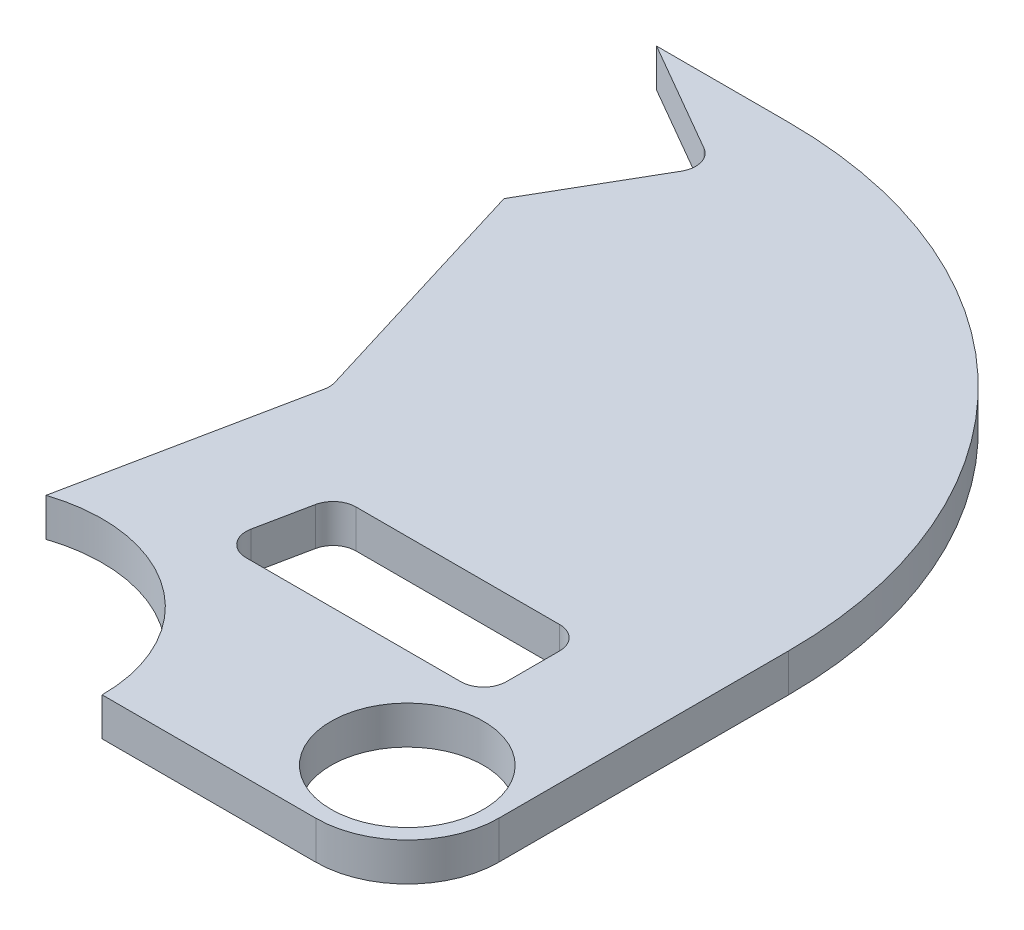
ISO-10303-21;
HEADER;
FILE_DESCRIPTION(('STEP AP214'),'2;1');
FILE_NAME('part.step','',(''),(''),'','','');
FILE_SCHEMA(('AUTOMOTIVE_DESIGN { 1 0 10303 214 1 1 1 1 }'));
ENDSEC;
DATA;
#1=APPLICATION_CONTEXT('core data for automotive mechanical design processes');
#2=APPLICATION_PROTOCOL_DEFINITION('international standard','automotive_design',2000,#1);
#3=PRODUCT_CONTEXT('',#1,'mechanical');
#4=PRODUCT('Part','Part','',(#3));
#5=PRODUCT_RELATED_PRODUCT_CATEGORY('part','',(#4));
#6=PRODUCT_DEFINITION_FORMATION('','',#4);
#7=PRODUCT_DEFINITION_CONTEXT('part definition',#1,'design');
#8=PRODUCT_DEFINITION('design','',#6,#7);
#9=PRODUCT_DEFINITION_SHAPE('','',#8);
#10=(LENGTH_UNIT() NAMED_UNIT(*) SI_UNIT(.MILLI.,.METRE.));
#11=(NAMED_UNIT(*) PLANE_ANGLE_UNIT() SI_UNIT($,.RADIAN.));
#12=(NAMED_UNIT(*) SI_UNIT($,.STERADIAN.) SOLID_ANGLE_UNIT());
#13=UNCERTAINTY_MEASURE_WITH_UNIT(LENGTH_MEASURE(1.E-05),#10,'distance_accuracy_value','');
#14=(GEOMETRIC_REPRESENTATION_CONTEXT(3) GLOBAL_UNCERTAINTY_ASSIGNED_CONTEXT((#13)) GLOBAL_UNIT_ASSIGNED_CONTEXT((#10,
#11,#12)) REPRESENTATION_CONTEXT('',''));
#15=CARTESIAN_POINT('',(0.,0.,0.));
#16=DIRECTION('',(0.,0.,1.));
#17=DIRECTION('',(1.,0.,0.));
#18=AXIS2_PLACEMENT_3D('',#15,#16,#17);
#19=CARTESIAN_POINT('',(0.,5.,50.));
#20=DIRECTION('',(0.,1.,0.));
#21=DIRECTION('',(0.,0.,1.));
#22=AXIS2_PLACEMENT_3D('',#19,#20,#21);
#23=PLANE('',#22);
#24=DIRECTION('',(0.,0.,-1.));
#25=VECTOR('',#24,1.);
#26=CARTESIAN_POINT('',(45.,5.,12.0294372515229));
#27=LINE('',#26,#25);
#28=CARTESIAN_POINT('',(45.,5.,22.));
#29=VERTEX_POINT('',#28);
#30=CARTESIAN_POINT('',(45.,5.,15.0294372515229));
#31=VERTEX_POINT('',#30);
#32=EDGE_CURVE('E396',#29,#31,#27,.T.);
#33=ORIENTED_EDGE('',*,*,#32,.F.);
#34=CARTESIAN_POINT('',(42.,5.,22.));
#35=DIRECTION('',(0.,1.,0.));
#36=DIRECTION('',(0.,0.,1.));
#37=AXIS2_PLACEMENT_3D('',#34,#35,#36);
#38=CIRCLE('',#37,3.);
#39=CARTESIAN_POINT('',(42.,5.,25.));
#40=VERTEX_POINT('',#39);
#41=EDGE_CURVE('E281',#29,#40,#38,.F.);
#42=ORIENTED_EDGE('',*,*,#41,.T.);
#43=DIRECTION('',(1.,0.,0.));
#44=VECTOR('',#43,1.);
#45=CARTESIAN_POINT('',(45.,5.,25.));
#46=LINE('',#45,#44);
#47=CARTESIAN_POINT('',(13.8804418757713,5.,25.));
#48=VERTEX_POINT('',#47);
#49=EDGE_CURVE('E387',#48,#40,#46,.T.);
#50=ORIENTED_EDGE('',*,*,#49,.F.);
#51=CARTESIAN_POINT('',(13.8804418757713,5.,22.));
#52=DIRECTION('',(0.,1.,0.));
#53=DIRECTION('',(0.,0.,1.));
#54=AXIS2_PLACEMENT_3D('',#51,#52,#53);
#55=CIRCLE('',#54,3.);
#56=CARTESIAN_POINT('',(10.9410541844315,5.,21.4));
#57=VERTEX_POINT('',#56);
#58=EDGE_CURVE('E285',#48,#57,#55,.F.);
#59=ORIENTED_EDGE('',*,*,#58,.T.);
#60=DIRECTION('',(-0.2,0.,0.979795897113271));
#61=VECTOR('',#60,1.);
#62=CARTESIAN_POINT('',(10.2062072615966,5.,25.));
#63=LINE('',#62,#61);
#64=CARTESIAN_POINT('',(12.36391434725,5.,14.4294372515229));
#65=VERTEX_POINT('',#64);
#66=EDGE_CURVE('E220',#65,#57,#63,.T.);
#67=ORIENTED_EDGE('',*,*,#66,.F.);
#68=CARTESIAN_POINT('',(15.3033020385898,5.,15.0294372515229));
#69=DIRECTION('',(0.,1.,0.));
#70=DIRECTION('',(0.,0.,1.));
#71=AXIS2_PLACEMENT_3D('',#68,#69,#70);
#72=CIRCLE('',#71,3.);
#73=CARTESIAN_POINT('',(15.3033020385898,5.,12.0294372515229));
#74=VERTEX_POINT('',#73);
#75=EDGE_CURVE('E289',#65,#74,#72,.F.);
#76=ORIENTED_EDGE('',*,*,#75,.T.);
#77=DIRECTION('',(-1.,0.,0.));
#78=VECTOR('',#77,1.);
#79=CARTESIAN_POINT('',(12.8538122958066,5.,12.0294372515229));
#80=LINE('',#79,#78);
#81=CARTESIAN_POINT('',(42.,5.,12.0294372515229));
#82=VERTEX_POINT('',#81);
#83=EDGE_CURVE('E393',#82,#74,#80,.T.);
#84=ORIENTED_EDGE('',*,*,#83,.F.);
#85=CARTESIAN_POINT('',(42.,5.,15.0294372515229));
#86=DIRECTION('',(0.,1.,0.));
#87=DIRECTION('',(0.,0.,1.));
#88=AXIS2_PLACEMENT_3D('',#85,#86,#87);
#89=CIRCLE('',#88,3.);
#90=EDGE_CURVE('E277',#82,#31,#89,.F.);
#91=ORIENTED_EDGE('',*,*,#90,.T.);
#92=EDGE_LOOP('',(#33,#42,#50,#59,#67,#76,#84,#91));
#93=FACE_BOUND('',#92,.T.);
#94=DIRECTION('',(0.292609232256339,0.,0.956232104249986));
#95=VECTOR('',#94,1.);
#96=CARTESIAN_POINT('',(-10.,5.,-32.679491924311));
#97=LINE('',#96,#95);
#98=CARTESIAN_POINT('',(-10.,5.,-32.679491924311));
#99=VERTEX_POINT('',#98);
#100=CARTESIAN_POINT('',(-0.223357320996515,5.,-0.729920376774135));
#101=VERTEX_POINT('',#100);
#102=EDGE_CURVE('E184',#99,#101,#97,.T.);
#103=ORIENTED_EDGE('',*,*,#102,.T.);
#104=CARTESIAN_POINT('',(-3.09205363374647,5.,0.147907319994881));
#105=DIRECTION('',(0.,1.,0.));
#106=DIRECTION('',(0.,0.,1.));
#107=AXIS2_PLACEMENT_3D('',#104,#105,#106);
#108=CIRCLE('',#107,3.);
#109=CARTESIAN_POINT('',(-0.15266594240666,5.,0.747907319994881));
#110=VERTEX_POINT('',#109);
#111=EDGE_CURVE('E180',#101,#110,#108,.F.);
#112=ORIENTED_EDGE('',*,*,#111,.T.);
#113=DIRECTION('',(-0.2,0.,0.979795897113271));
#114=VECTOR('',#113,1.);
#115=CARTESIAN_POINT('',(0.,5.,0.));
#116=LINE('',#115,#114);
#117=CARTESIAN_POINT('',(-6.33385735599495,5.,31.0294372515229));
#118=VERTEX_POINT('',#117);
#119=EDGE_CURVE('E172',#110,#118,#116,.T.);
#120=ORIENTED_EDGE('',*,*,#119,.T.);
#121=CARTESIAN_POINT('',(0.,5.,50.));
#122=DIRECTION('',(0.,-1.,0.));
#123=DIRECTION('',(0.,0.,1.));
#124=AXIS2_PLACEMENT_3D('',#121,#122,#123);
#125=CIRCLE('',#124,20.);
#126=CARTESIAN_POINT('',(20.,5.,50.));
#127=VERTEX_POINT('',#126);
#128=EDGE_CURVE('E177',#118,#127,#125,.T.);
#129=ORIENTED_EDGE('',*,*,#128,.T.);
#130=DIRECTION('',(1.,0.,0.));
#131=VECTOR('',#130,1.);
#132=CARTESIAN_POINT('',(48.,5.,50.));
#133=LINE('',#132,#131);
#134=CARTESIAN_POINT('',(48.,5.,50.));
#135=VERTEX_POINT('',#134);
#136=EDGE_CURVE('E199',#127,#135,#133,.T.);
#137=ORIENTED_EDGE('',*,*,#136,.T.);
#138=CARTESIAN_POINT('',(48.,5.,38.));
#139=DIRECTION('',(0.,1.,0.));
#140=DIRECTION('',(0.,0.,1.));
#141=AXIS2_PLACEMENT_3D('',#138,#139,#140);
#142=CIRCLE('',#141,12.);
#143=CARTESIAN_POINT('',(60.,5.,38.));
#144=VERTEX_POINT('',#143);
#145=EDGE_CURVE('E201',#135,#144,#142,.T.);
#146=ORIENTED_EDGE('',*,*,#145,.T.);
#147=DIRECTION('',(0.,0.,-1.));
#148=VECTOR('',#147,1.);
#149=CARTESIAN_POINT('',(60.,5.,0.));
#150=LINE('',#149,#148);
#151=CARTESIAN_POINT('',(60.,5.,0.));
#152=VERTEX_POINT('',#151);
#153=EDGE_CURVE('E206',#144,#152,#150,.T.);
#154=ORIENTED_EDGE('',*,*,#153,.T.);
#155=CARTESIAN_POINT('',(0.,5.,0.));
#156=DIRECTION('',(0.,1.,0.));
#157=DIRECTION('',(0.,0.,1.));
#158=AXIS2_PLACEMENT_3D('',#155,#156,#157);
#159=CIRCLE('',#158,60.);
#160=CARTESIAN_POINT('',(0.,5.,-60.));
#161=VERTEX_POINT('',#160);
#162=EDGE_CURVE('E208',#152,#161,#159,.T.);
#163=ORIENTED_EDGE('',*,*,#162,.T.);
#164=DIRECTION('',(-1.,0.,0.));
#165=VECTOR('',#164,1.);
#166=CARTESIAN_POINT('',(0.,5.,-60.));
#167=LINE('',#166,#165);
#168=CARTESIAN_POINT('',(-17.320508075689,5.,-60.));
#169=VERTEX_POINT('',#168);
#170=EDGE_CURVE('E210',#161,#169,#167,.T.);
#171=ORIENTED_EDGE('',*,*,#170,.T.);
#172=DIRECTION('',(0.866025403784442,0.,0.499999999999995));
#173=VECTOR('',#172,1.);
#174=CARTESIAN_POINT('',(-17.320508075689,5.,-60.));
#175=LINE('',#174,#173);
#176=CARTESIAN_POINT('',(-2.59807621135333,5.,-51.5));
#177=VERTEX_POINT('',#176);
#178=EDGE_CURVE('E212',#169,#177,#175,.T.);
#179=ORIENTED_EDGE('',*,*,#178,.T.);
#180=CARTESIAN_POINT('',(-4.09807621135331,5.,-48.9019237886467));
#181=DIRECTION('',(0.,1.,0.));
#182=DIRECTION('',(0.,0.,1.));
#183=AXIS2_PLACEMENT_3D('',#180,#181,#182);
#184=CIRCLE('',#183,3.);
#185=CARTESIAN_POINT('',(-1.49999999999999,5.,-47.4019237886467));
#186=VERTEX_POINT('',#185);
#187=EDGE_CURVE('E11',#177,#186,#184,.F.);
#188=ORIENTED_EDGE('',*,*,#187,.T.);
#189=DIRECTION('',(-0.499999999999995,0.,0.866025403784442));
#190=VECTOR('',#189,1.);
#191=CARTESIAN_POINT('',(0.,5.,-50.));
#192=LINE('',#191,#190);
#193=EDGE_CURVE('E214',#186,#99,#192,.T.);
#194=ORIENTED_EDGE('',*,*,#193,.T.);
#195=EDGE_LOOP('',(#103,#112,#120,#129,#137,#146,#154,#163,#171,#179,#188,#194));
#196=FACE_BOUND('',#195,.T.);
#197=CARTESIAN_POINT('',(48.,5.,38.));
#198=DIRECTION('',(0.,1.,0.));
#199=DIRECTION('',(0.,0.,1.));
#200=AXIS2_PLACEMENT_3D('',#197,#198,#199);
#201=CIRCLE('',#200,9.99999999999999);
#202=CARTESIAN_POINT('',(48.,5.,48.));
#203=VERTEX_POINT('',#202);
#204=EDGE_CURVE('E404',#203,#203,#201,.T.);
#205=ORIENTED_EDGE('',*,*,#204,.F.);
#206=EDGE_LOOP('',(#205));
#207=FACE_BOUND('',#206,.T.);
#208=ADVANCED_FACE('F36',(#93,#196,#207),#23,.T.);
#209=CARTESIAN_POINT('',(0.,0.,50.));
#210=DIRECTION('',(0.,1.,0.));
#211=DIRECTION('',(0.,0.,1.));
#212=AXIS2_PLACEMENT_3D('',#209,#210,#211);
#213=PLANE('',#212);
#214=DIRECTION('',(0.292609232256339,0.,0.956232104249986));
#215=VECTOR('',#214,1.);
#216=CARTESIAN_POINT('',(-10.,0.,-32.679491924311));
#217=LINE('',#216,#215);
#218=CARTESIAN_POINT('',(-10.,0.,-32.679491924311));
#219=VERTEX_POINT('',#218);
#220=CARTESIAN_POINT('',(-0.223357320996515,0.,-0.729920376774135));
#221=VERTEX_POINT('',#220);
#222=EDGE_CURVE('E217',#219,#221,#217,.T.);
#223=ORIENTED_EDGE('',*,*,#222,.F.);
#224=DIRECTION('',(-0.499999999999995,0.,0.866025403784442));
#225=VECTOR('',#224,1.);
#226=CARTESIAN_POINT('',(0.,0.,-50.));
#227=LINE('',#226,#225);
#228=CARTESIAN_POINT('',(-1.49999999999999,0.,-47.4019237886467));
#229=VERTEX_POINT('',#228);
#230=EDGE_CURVE('E236',#229,#219,#227,.T.);
#231=ORIENTED_EDGE('',*,*,#230,.F.);
#232=CARTESIAN_POINT('',(-4.09807621135331,0.,-48.9019237886467));
#233=DIRECTION('',(0.,1.,0.));
#234=DIRECTION('',(0.,0.,1.));
#235=AXIS2_PLACEMENT_3D('',#232,#233,#234);
#236=CIRCLE('',#235,3.);
#237=CARTESIAN_POINT('',(-2.59807621135333,0.,-51.5));
#238=VERTEX_POINT('',#237);
#239=EDGE_CURVE('E44',#229,#238,#236,.T.);
#240=ORIENTED_EDGE('',*,*,#239,.T.);
#241=DIRECTION('',(0.866025403784442,0.,0.499999999999995));
#242=VECTOR('',#241,1.);
#243=CARTESIAN_POINT('',(-17.320508075689,0.,-60.));
#244=LINE('',#243,#242);
#245=CARTESIAN_POINT('',(-17.320508075689,0.,-60.));
#246=VERTEX_POINT('',#245);
#247=EDGE_CURVE('E234',#246,#238,#244,.T.);
#248=ORIENTED_EDGE('',*,*,#247,.F.);
#249=DIRECTION('',(-1.,0.,0.));
#250=VECTOR('',#249,1.);
#251=CARTESIAN_POINT('',(0.,0.,-60.));
#252=LINE('',#251,#250);
#253=CARTESIAN_POINT('',(0.,0.,-60.));
#254=VERTEX_POINT('',#253);
#255=EDGE_CURVE('E232',#254,#246,#252,.T.);
#256=ORIENTED_EDGE('',*,*,#255,.F.);
#257=CARTESIAN_POINT('',(0.,0.,0.));
#258=DIRECTION('',(0.,1.,0.));
#259=DIRECTION('',(0.,0.,1.));
#260=AXIS2_PLACEMENT_3D('',#257,#258,#259);
#261=CIRCLE('',#260,60.);
#262=CARTESIAN_POINT('',(60.,0.,0.));
#263=VERTEX_POINT('',#262);
#264=EDGE_CURVE('E230',#263,#254,#261,.T.);
#265=ORIENTED_EDGE('',*,*,#264,.F.);
#266=DIRECTION('',(0.,0.,-1.));
#267=VECTOR('',#266,1.);
#268=CARTESIAN_POINT('',(60.,0.,0.));
#269=LINE('',#268,#267);
#270=CARTESIAN_POINT('',(60.,0.,38.));
#271=VERTEX_POINT('',#270);
#272=EDGE_CURVE('E228',#271,#263,#269,.T.);
#273=ORIENTED_EDGE('',*,*,#272,.F.);
#274=CARTESIAN_POINT('',(48.,0.,38.));
#275=DIRECTION('',(0.,1.,0.));
#276=DIRECTION('',(0.,0.,1.));
#277=AXIS2_PLACEMENT_3D('',#274,#275,#276);
#278=CIRCLE('',#277,12.);
#279=CARTESIAN_POINT('',(48.,0.,50.));
#280=VERTEX_POINT('',#279);
#281=EDGE_CURVE('E226',#280,#271,#278,.T.);
#282=ORIENTED_EDGE('',*,*,#281,.F.);
#283=DIRECTION('',(1.,0.,0.));
#284=VECTOR('',#283,1.);
#285=CARTESIAN_POINT('',(48.,0.,50.));
#286=LINE('',#285,#284);
#287=CARTESIAN_POINT('',(20.,0.,50.));
#288=VERTEX_POINT('',#287);
#289=EDGE_CURVE('E224',#288,#280,#286,.T.);
#290=ORIENTED_EDGE('',*,*,#289,.F.);
#291=CARTESIAN_POINT('',(0.,0.,50.));
#292=DIRECTION('',(0.,-1.,0.));
#293=DIRECTION('',(0.,0.,1.));
#294=AXIS2_PLACEMENT_3D('',#291,#292,#293);
#295=CIRCLE('',#294,20.);
#296=CARTESIAN_POINT('',(-6.33385735599495,0.,31.0294372515229));
#297=VERTEX_POINT('',#296);
#298=EDGE_CURVE('E222',#297,#288,#295,.T.);
#299=ORIENTED_EDGE('',*,*,#298,.F.);
#300=DIRECTION('',(-0.2,0.,0.979795897113271));
#301=VECTOR('',#300,1.);
#302=CARTESIAN_POINT('',(0.,0.,0.));
#303=LINE('',#302,#301);
#304=CARTESIAN_POINT('',(-0.15266594240666,0.,0.747907319994881));
#305=VERTEX_POINT('',#304);
#306=EDGE_CURVE('E190',#305,#297,#303,.T.);
#307=ORIENTED_EDGE('',*,*,#306,.F.);
#308=CARTESIAN_POINT('',(-3.09205363374647,0.,0.147907319994881));
#309=DIRECTION('',(0.,1.,0.));
#310=DIRECTION('',(0.,0.,1.));
#311=AXIS2_PLACEMENT_3D('',#308,#309,#310);
#312=CIRCLE('',#311,3.);
#313=EDGE_CURVE('E299',#305,#221,#312,.T.);
#314=ORIENTED_EDGE('',*,*,#313,.T.);
#315=EDGE_LOOP('',(#223,#231,#240,#248,#256,#265,#273,#282,#290,#299,#307,#314));
#316=FACE_BOUND('',#315,.T.);
#317=DIRECTION('',(-0.2,0.,0.979795897113271));
#318=VECTOR('',#317,1.);
#319=CARTESIAN_POINT('',(10.2062072615966,0.,25.));
#320=LINE('',#319,#318);
#321=CARTESIAN_POINT('',(12.36391434725,0.,14.4294372515229));
#322=VERTEX_POINT('',#321);
#323=CARTESIAN_POINT('',(10.9410541844315,0.,21.4));
#324=VERTEX_POINT('',#323);
#325=EDGE_CURVE('E410',#322,#324,#320,.T.);
#326=ORIENTED_EDGE('',*,*,#325,.T.);
#327=CARTESIAN_POINT('',(13.8804418757713,0.,22.));
#328=DIRECTION('',(0.,1.,0.));
#329=DIRECTION('',(0.,0.,1.));
#330=AXIS2_PLACEMENT_3D('',#327,#328,#329);
#331=CIRCLE('',#330,3.);
#332=CARTESIAN_POINT('',(13.8804418757713,0.,25.));
#333=VERTEX_POINT('',#332);
#334=EDGE_CURVE('E283',#324,#333,#331,.T.);
#335=ORIENTED_EDGE('',*,*,#334,.T.);
#336=DIRECTION('',(1.,0.,0.));
#337=VECTOR('',#336,1.);
#338=CARTESIAN_POINT('',(45.,0.,25.));
#339=LINE('',#338,#337);
#340=CARTESIAN_POINT('',(42.,0.,25.));
#341=VERTEX_POINT('',#340);
#342=EDGE_CURVE('E400',#333,#341,#339,.T.);
#343=ORIENTED_EDGE('',*,*,#342,.T.);
#344=CARTESIAN_POINT('',(42.,0.,22.));
#345=DIRECTION('',(0.,1.,0.));
#346=DIRECTION('',(0.,0.,1.));
#347=AXIS2_PLACEMENT_3D('',#344,#345,#346);
#348=CIRCLE('',#347,3.);
#349=CARTESIAN_POINT('',(45.,0.,22.));
#350=VERTEX_POINT('',#349);
#351=EDGE_CURVE('E279',#341,#350,#348,.T.);
#352=ORIENTED_EDGE('',*,*,#351,.T.);
#353=DIRECTION('',(0.,0.,-1.));
#354=VECTOR('',#353,1.);
#355=CARTESIAN_POINT('',(45.,0.,12.0294372515229));
#356=LINE('',#355,#354);
#357=CARTESIAN_POINT('',(45.,0.,15.0294372515229));
#358=VERTEX_POINT('',#357);
#359=EDGE_CURVE('E403',#350,#358,#356,.T.);
#360=ORIENTED_EDGE('',*,*,#359,.T.);
#361=CARTESIAN_POINT('',(42.,0.,15.0294372515229));
#362=DIRECTION('',(0.,1.,0.));
#363=DIRECTION('',(0.,0.,1.));
#364=AXIS2_PLACEMENT_3D('',#361,#362,#363);
#365=CIRCLE('',#364,3.);
#366=CARTESIAN_POINT('',(42.,0.,12.0294372515229));
#367=VERTEX_POINT('',#366);
#368=EDGE_CURVE('E275',#358,#367,#365,.T.);
#369=ORIENTED_EDGE('',*,*,#368,.T.);
#370=DIRECTION('',(-1.,0.,0.));
#371=VECTOR('',#370,1.);
#372=CARTESIAN_POINT('',(12.8538122958066,0.,12.0294372515229));
#373=LINE('',#372,#371);
#374=CARTESIAN_POINT('',(15.3033020385898,0.,12.0294372515229));
#375=VERTEX_POINT('',#374);
#376=EDGE_CURVE('E407',#367,#375,#373,.T.);
#377=ORIENTED_EDGE('',*,*,#376,.T.);
#378=CARTESIAN_POINT('',(15.3033020385898,0.,15.0294372515229));
#379=DIRECTION('',(0.,1.,0.));
#380=DIRECTION('',(0.,0.,1.));
#381=AXIS2_PLACEMENT_3D('',#378,#379,#380);
#382=CIRCLE('',#381,3.);
#383=EDGE_CURVE('E287',#375,#322,#382,.T.);
#384=ORIENTED_EDGE('',*,*,#383,.T.);
#385=EDGE_LOOP('',(#326,#335,#343,#352,#360,#369,#377,#384));
#386=FACE_BOUND('',#385,.T.);
#387=CARTESIAN_POINT('',(48.,0.,38.));
#388=DIRECTION('',(0.,1.,0.));
#389=DIRECTION('',(0.,0.,1.));
#390=AXIS2_PLACEMENT_3D('',#387,#388,#389);
#391=CIRCLE('',#390,9.99999999999999);
#392=CARTESIAN_POINT('',(48.,0.,48.));
#393=VERTEX_POINT('',#392);
#394=EDGE_CURVE('E433',#393,#393,#391,.T.);
#395=ORIENTED_EDGE('',*,*,#394,.T.);
#396=EDGE_LOOP('',(#395));
#397=FACE_BOUND('',#396,.T.);
#398=ADVANCED_FACE('F302',(#316,#386,#397),#213,.F.);
#399=CARTESIAN_POINT('',(-10.,5.,-32.679491924311));
#400=DIRECTION('',(0.956232104249986,0.,-0.292609232256339));
#401=DIRECTION('',(-0.292609232256339,0.,-0.956232104249986));
#402=AXIS2_PLACEMENT_3D('',#399,#400,#401);
#403=PLANE('',#402);
#404=ORIENTED_EDGE('',*,*,#222,.T.);
#405=DIRECTION('',(0.,-1.,0.));
#406=VECTOR('',#405,1.);
#407=CARTESIAN_POINT('',(-0.223357320996514,5.,-0.729920376774135));
#408=LINE('',#407,#406);
#409=EDGE_CURVE('E293',#221,#101,#408,.F.);
#410=ORIENTED_EDGE('',*,*,#409,.T.);
#411=ORIENTED_EDGE('',*,*,#102,.F.);
#412=DIRECTION('',(0.,-1.,0.));
#413=VECTOR('',#412,1.);
#414=CARTESIAN_POINT('',(-10.,5.,-32.679491924311));
#415=LINE('',#414,#413);
#416=EDGE_CURVE('E216',#99,#219,#415,.T.);
#417=ORIENTED_EDGE('',*,*,#416,.T.);
#418=EDGE_LOOP('',(#404,#410,#411,#417));
#419=FACE_BOUND('',#418,.T.);
#420=ADVANCED_FACE('F307',(#419),#403,.F.);
#421=CARTESIAN_POINT('',(0.,5.,0.));
#422=DIRECTION('',(0.979795897113271,0.,0.2));
#423=DIRECTION('',(0.2,0.,-0.979795897113271));
#424=AXIS2_PLACEMENT_3D('',#421,#422,#423);
#425=PLANE('',#424);
#426=ORIENTED_EDGE('',*,*,#119,.F.);
#427=DIRECTION('',(0.,-1.,0.));
#428=VECTOR('',#427,1.);
#429=CARTESIAN_POINT('',(-0.15266594240666,0.,0.747907319994881));
#430=LINE('',#429,#428);
#431=EDGE_CURVE('E291',#110,#305,#430,.T.);
#432=ORIENTED_EDGE('',*,*,#431,.T.);
#433=ORIENTED_EDGE('',*,*,#306,.T.);
#434=DIRECTION('',(0.,-1.,0.));
#435=VECTOR('',#434,1.);
#436=CARTESIAN_POINT('',(-6.33385735599495,5.,31.0294372515229));
#437=LINE('',#436,#435);
#438=EDGE_CURVE('E187',#118,#297,#437,.T.);
#439=ORIENTED_EDGE('',*,*,#438,.F.);
#440=EDGE_LOOP('',(#426,#432,#433,#439));
#441=FACE_BOUND('',#440,.T.);
#442=ADVANCED_FACE('F188',(#441),#425,.F.);
#443=CARTESIAN_POINT('',(0.,5.,50.));
#444=DIRECTION('',(0.,-1.,0.));
#445=DIRECTION('',(0.,0.,-1.));
#446=AXIS2_PLACEMENT_3D('',#443,#444,#445);
#447=CYLINDRICAL_SURFACE('',#446,20.);
#448=ORIENTED_EDGE('',*,*,#298,.T.);
#449=DIRECTION('',(0.,-1.,0.));
#450=VECTOR('',#449,1.);
#451=CARTESIAN_POINT('',(20.,5.,50.));
#452=LINE('',#451,#450);
#453=EDGE_CURVE('E194',#127,#288,#452,.T.);
#454=ORIENTED_EDGE('',*,*,#453,.F.);
#455=ORIENTED_EDGE('',*,*,#128,.F.);
#456=ORIENTED_EDGE('',*,*,#438,.T.);
#457=EDGE_LOOP('',(#448,#454,#455,#456));
#458=FACE_BOUND('',#457,.T.);
#459=ADVANCED_FACE('F196',(#458),#447,.F.);
#460=CARTESIAN_POINT('',(48.,5.,50.));
#461=DIRECTION('',(0.,0.,-1.));
#462=DIRECTION('',(-1.,0.,0.));
#463=AXIS2_PLACEMENT_3D('',#460,#461,#462);
#464=PLANE('',#463);
#465=ORIENTED_EDGE('',*,*,#289,.T.);
#466=DIRECTION('',(0.,-1.,0.));
#467=VECTOR('',#466,1.);
#468=CARTESIAN_POINT('',(48.,5.,50.));
#469=LINE('',#468,#467);
#470=EDGE_CURVE('E252',#135,#280,#469,.T.);
#471=ORIENTED_EDGE('',*,*,#470,.F.);
#472=ORIENTED_EDGE('',*,*,#136,.F.);
#473=ORIENTED_EDGE('',*,*,#453,.T.);
#474=EDGE_LOOP('',(#465,#471,#472,#473));
#475=FACE_BOUND('',#474,.T.);
#476=ADVANCED_FACE('F355',(#475),#464,.F.);
#477=CARTESIAN_POINT('',(48.,5.,38.));
#478=DIRECTION('',(0.,-1.,0.));
#479=DIRECTION('',(0.,0.,-1.));
#480=AXIS2_PLACEMENT_3D('',#477,#478,#479);
#481=CYLINDRICAL_SURFACE('',#480,12.);
#482=ORIENTED_EDGE('',*,*,#281,.T.);
#483=DIRECTION('',(0.,-1.,0.));
#484=VECTOR('',#483,1.);
#485=CARTESIAN_POINT('',(60.,5.,38.));
#486=LINE('',#485,#484);
#487=EDGE_CURVE('E249',#144,#271,#486,.T.);
#488=ORIENTED_EDGE('',*,*,#487,.F.);
#489=ORIENTED_EDGE('',*,*,#145,.F.);
#490=ORIENTED_EDGE('',*,*,#470,.T.);
#491=EDGE_LOOP('',(#482,#488,#489,#490));
#492=FACE_BOUND('',#491,.T.);
#493=ADVANCED_FACE('F351',(#492),#481,.T.);
#494=CARTESIAN_POINT('',(60.,5.,0.));
#495=DIRECTION('',(-1.,0.,0.));
#496=DIRECTION('',(0.,0.,1.));
#497=AXIS2_PLACEMENT_3D('',#494,#495,#496);
#498=PLANE('',#497);
#499=ORIENTED_EDGE('',*,*,#272,.T.);
#500=DIRECTION('',(0.,-1.,0.));
#501=VECTOR('',#500,1.);
#502=CARTESIAN_POINT('',(60.,5.,0.));
#503=LINE('',#502,#501);
#504=EDGE_CURVE('E246',#152,#263,#503,.T.);
#505=ORIENTED_EDGE('',*,*,#504,.F.);
#506=ORIENTED_EDGE('',*,*,#153,.F.);
#507=ORIENTED_EDGE('',*,*,#487,.T.);
#508=EDGE_LOOP('',(#499,#505,#506,#507));
#509=FACE_BOUND('',#508,.T.);
#510=ADVANCED_FACE('F347',(#509),#498,.F.);
#511=CARTESIAN_POINT('',(0.,5.,0.));
#512=DIRECTION('',(0.,-1.,0.));
#513=DIRECTION('',(0.,0.,-1.));
#514=AXIS2_PLACEMENT_3D('',#511,#512,#513);
#515=CYLINDRICAL_SURFACE('',#514,60.);
#516=ORIENTED_EDGE('',*,*,#264,.T.);
#517=DIRECTION('',(0.,-1.,0.));
#518=VECTOR('',#517,1.);
#519=CARTESIAN_POINT('',(0.,5.,-60.));
#520=LINE('',#519,#518);
#521=EDGE_CURVE('E243',#161,#254,#520,.T.);
#522=ORIENTED_EDGE('',*,*,#521,.F.);
#523=ORIENTED_EDGE('',*,*,#162,.F.);
#524=ORIENTED_EDGE('',*,*,#504,.T.);
#525=EDGE_LOOP('',(#516,#522,#523,#524));
#526=FACE_BOUND('',#525,.T.);
#527=ADVANCED_FACE('F343',(#526),#515,.T.);
#528=CARTESIAN_POINT('',(0.,5.,-60.));
#529=DIRECTION('',(0.,0.,1.));
#530=DIRECTION('',(1.,0.,0.));
#531=AXIS2_PLACEMENT_3D('',#528,#529,#530);
#532=PLANE('',#531);
#533=ORIENTED_EDGE('',*,*,#255,.T.);
#534=DIRECTION('',(0.,-1.,0.));
#535=VECTOR('',#534,1.);
#536=CARTESIAN_POINT('',(-17.320508075689,5.,-60.));
#537=LINE('',#536,#535);
#538=EDGE_CURVE('E240',#169,#246,#537,.T.);
#539=ORIENTED_EDGE('',*,*,#538,.F.);
#540=ORIENTED_EDGE('',*,*,#170,.F.);
#541=ORIENTED_EDGE('',*,*,#521,.T.);
#542=EDGE_LOOP('',(#533,#539,#540,#541));
#543=FACE_BOUND('',#542,.T.);
#544=ADVANCED_FACE('F340',(#543),#532,.F.);
#545=CARTESIAN_POINT('',(-17.320508075689,5.,-60.));
#546=DIRECTION('',(0.499999999999995,0.,-0.866025403784442));
#547=DIRECTION('',(-0.866025403784442,0.,-0.499999999999995));
#548=AXIS2_PLACEMENT_3D('',#545,#546,#547);
#549=PLANE('',#548);
#550=ORIENTED_EDGE('',*,*,#247,.T.);
#551=DIRECTION('',(0.,-1.,0.));
#552=VECTOR('',#551,1.);
#553=CARTESIAN_POINT('',(-2.59807621135333,5.,-51.5));
#554=LINE('',#553,#552);
#555=EDGE_CURVE('E51',#238,#177,#554,.F.);
#556=ORIENTED_EDGE('',*,*,#555,.T.);
#557=ORIENTED_EDGE('',*,*,#178,.F.);
#558=ORIENTED_EDGE('',*,*,#538,.T.);
#559=EDGE_LOOP('',(#550,#556,#557,#558));
#560=FACE_BOUND('',#559,.T.);
#561=ADVANCED_FACE('F336',(#560),#549,.F.);
#562=CARTESIAN_POINT('',(0.,5.,-50.));
#563=DIRECTION('',(0.866025403784442,0.,0.499999999999995));
#564=DIRECTION('',(0.499999999999995,0.,-0.866025403784442));
#565=AXIS2_PLACEMENT_3D('',#562,#563,#564);
#566=PLANE('',#565);
#567=ORIENTED_EDGE('',*,*,#193,.F.);
#568=DIRECTION('',(0.,-1.,0.));
#569=VECTOR('',#568,1.);
#570=CARTESIAN_POINT('',(-1.49999999999999,0.,-47.4019237886467));
#571=LINE('',#570,#569);
#572=EDGE_CURVE('E295',#186,#229,#571,.T.);
#573=ORIENTED_EDGE('',*,*,#572,.T.);
#574=ORIENTED_EDGE('',*,*,#230,.T.);
#575=ORIENTED_EDGE('',*,*,#416,.F.);
#576=EDGE_LOOP('',(#567,#573,#574,#575));
#577=FACE_BOUND('',#576,.T.);
#578=ADVANCED_FACE('F333',(#577),#566,.F.);
#579=CARTESIAN_POINT('',(45.,5.,25.));
#580=DIRECTION('',(0.,0.,-1.));
#581=DIRECTION('',(-1.,0.,0.));
#582=AXIS2_PLACEMENT_3D('',#579,#580,#581);
#583=PLANE('',#582);
#584=ORIENTED_EDGE('',*,*,#49,.T.);
#585=DIRECTION('',(0.,-1.,0.));
#586=VECTOR('',#585,1.);
#587=CARTESIAN_POINT('',(42.,0.,25.));
#588=LINE('',#587,#586);
#589=EDGE_CURVE('E267',#40,#341,#588,.T.);
#590=ORIENTED_EDGE('',*,*,#589,.T.);
#591=ORIENTED_EDGE('',*,*,#342,.F.);
#592=DIRECTION('',(0.,-1.,0.));
#593=VECTOR('',#592,1.);
#594=CARTESIAN_POINT('',(13.8804418757713,5.,25.));
#595=LINE('',#594,#593);
#596=EDGE_CURVE('E265',#333,#48,#595,.F.);
#597=ORIENTED_EDGE('',*,*,#596,.T.);
#598=EDGE_LOOP('',(#584,#590,#591,#597));
#599=FACE_BOUND('',#598,.T.);
#600=ADVANCED_FACE('F330',(#599),#583,.T.);
#601=CARTESIAN_POINT('',(45.,5.,12.0294372515229));
#602=DIRECTION('',(-1.,0.,0.));
#603=DIRECTION('',(0.,0.,1.));
#604=AXIS2_PLACEMENT_3D('',#601,#602,#603);
#605=PLANE('',#604);
#606=ORIENTED_EDGE('',*,*,#32,.T.);
#607=DIRECTION('',(0.,-1.,0.));
#608=VECTOR('',#607,1.);
#609=CARTESIAN_POINT('',(45.,0.,15.0294372515229));
#610=LINE('',#609,#608);
#611=EDGE_CURVE('E257',#31,#358,#610,.T.);
#612=ORIENTED_EDGE('',*,*,#611,.T.);
#613=ORIENTED_EDGE('',*,*,#359,.F.);
#614=DIRECTION('',(0.,-1.,0.));
#615=VECTOR('',#614,1.);
#616=CARTESIAN_POINT('',(45.,5.,22.));
#617=LINE('',#616,#615);
#618=EDGE_CURVE('E193',#350,#29,#617,.F.);
#619=ORIENTED_EDGE('',*,*,#618,.T.);
#620=EDGE_LOOP('',(#606,#612,#613,#619));
#621=FACE_BOUND('',#620,.T.);
#622=ADVANCED_FACE('F451',(#621),#605,.T.);
#623=CARTESIAN_POINT('',(12.8538122958066,5.,12.0294372515229));
#624=DIRECTION('',(0.,0.,1.));
#625=DIRECTION('',(1.,0.,0.));
#626=AXIS2_PLACEMENT_3D('',#623,#624,#625);
#627=PLANE('',#626);
#628=ORIENTED_EDGE('',*,*,#376,.F.);
#629=DIRECTION('',(0.,-1.,0.));
#630=VECTOR('',#629,1.);
#631=CARTESIAN_POINT('',(42.,5.,12.0294372515229));
#632=LINE('',#631,#630);
#633=EDGE_CURVE('E263',#367,#82,#632,.F.);
#634=ORIENTED_EDGE('',*,*,#633,.T.);
#635=ORIENTED_EDGE('',*,*,#83,.T.);
#636=DIRECTION('',(0.,-1.,0.));
#637=VECTOR('',#636,1.);
#638=CARTESIAN_POINT('',(15.3033020385898,0.,12.0294372515229));
#639=LINE('',#638,#637);
#640=EDGE_CURVE('E260',#74,#375,#639,.T.);
#641=ORIENTED_EDGE('',*,*,#640,.T.);
#642=EDGE_LOOP('',(#628,#634,#635,#641));
#643=FACE_BOUND('',#642,.T.);
#644=ADVANCED_FACE('F447',(#643),#627,.T.);
#645=CARTESIAN_POINT('',(10.2062072615966,5.,25.));
#646=DIRECTION('',(0.979795897113271,0.,0.2));
#647=DIRECTION('',(0.2,0.,-0.979795897113271));
#648=AXIS2_PLACEMENT_3D('',#645,#646,#647);
#649=PLANE('',#648);
#650=ORIENTED_EDGE('',*,*,#66,.T.);
#651=DIRECTION('',(0.,-1.,0.));
#652=VECTOR('',#651,1.);
#653=CARTESIAN_POINT('',(10.9410541844315,0.,21.4));
#654=LINE('',#653,#652);
#655=EDGE_CURVE('E272',#57,#324,#654,.T.);
#656=ORIENTED_EDGE('',*,*,#655,.T.);
#657=ORIENTED_EDGE('',*,*,#325,.F.);
#658=DIRECTION('',(0.,-1.,0.));
#659=VECTOR('',#658,1.);
#660=CARTESIAN_POINT('',(12.36391434725,5.,14.4294372515229));
#661=LINE('',#660,#659);
#662=EDGE_CURVE('E270',#322,#65,#661,.F.);
#663=ORIENTED_EDGE('',*,*,#662,.T.);
#664=EDGE_LOOP('',(#650,#656,#657,#663));
#665=FACE_BOUND('',#664,.T.);
#666=ADVANCED_FACE('F389',(#665),#649,.T.);
#667=CARTESIAN_POINT('',(48.,5.,38.));
#668=DIRECTION('',(0.,-1.,0.));
#669=DIRECTION('',(0.,0.,-1.));
#670=AXIS2_PLACEMENT_3D('',#667,#668,#669);
#671=CYLINDRICAL_SURFACE('',#670,9.99999999999999);
#672=ORIENTED_EDGE('',*,*,#204,.T.);
#673=EDGE_LOOP('',(#672));
#674=FACE_BOUND('',#673,.T.);
#675=ORIENTED_EDGE('',*,*,#394,.F.);
#676=EDGE_LOOP('',(#675));
#677=FACE_BOUND('',#676,.T.);
#678=ADVANCED_FACE('F370',(#674,#677),#671,.F.);
#679=CARTESIAN_POINT('',(42.,5.,15.0294372515229));
#680=DIRECTION('',(0.,1.,0.));
#681=DIRECTION('',(0.,0.,1.));
#682=AXIS2_PLACEMENT_3D('',#679,#680,#681);
#683=CYLINDRICAL_SURFACE('',#682,3.);
#684=ORIENTED_EDGE('',*,*,#90,.F.);
#685=ORIENTED_EDGE('',*,*,#633,.F.);
#686=ORIENTED_EDGE('',*,*,#368,.F.);
#687=ORIENTED_EDGE('',*,*,#611,.F.);
#688=EDGE_LOOP('',(#684,#685,#686,#687));
#689=FACE_BOUND('',#688,.T.);
#690=ADVANCED_FACE('F366',(#689),#683,.F.);
#691=CARTESIAN_POINT('',(42.,5.,22.));
#692=DIRECTION('',(0.,1.,0.));
#693=DIRECTION('',(0.,0.,1.));
#694=AXIS2_PLACEMENT_3D('',#691,#692,#693);
#695=CYLINDRICAL_SURFACE('',#694,3.);
#696=ORIENTED_EDGE('',*,*,#41,.F.);
#697=ORIENTED_EDGE('',*,*,#618,.F.);
#698=ORIENTED_EDGE('',*,*,#351,.F.);
#699=ORIENTED_EDGE('',*,*,#589,.F.);
#700=EDGE_LOOP('',(#696,#697,#698,#699));
#701=FACE_BOUND('',#700,.T.);
#702=ADVANCED_FACE('F369',(#701),#695,.F.);
#703=CARTESIAN_POINT('',(13.8804418757713,5.,22.));
#704=DIRECTION('',(0.,1.,0.));
#705=DIRECTION('',(0.,0.,1.));
#706=AXIS2_PLACEMENT_3D('',#703,#704,#705);
#707=CYLINDRICAL_SURFACE('',#706,3.);
#708=ORIENTED_EDGE('',*,*,#58,.F.);
#709=ORIENTED_EDGE('',*,*,#596,.F.);
#710=ORIENTED_EDGE('',*,*,#334,.F.);
#711=ORIENTED_EDGE('',*,*,#655,.F.);
#712=EDGE_LOOP('',(#708,#709,#710,#711));
#713=FACE_BOUND('',#712,.T.);
#714=ADVANCED_FACE('F318',(#713),#707,.F.);
#715=CARTESIAN_POINT('',(15.3033020385898,5.,15.0294372515229));
#716=DIRECTION('',(0.,1.,0.));
#717=DIRECTION('',(0.,0.,1.));
#718=AXIS2_PLACEMENT_3D('',#715,#716,#717);
#719=CYLINDRICAL_SURFACE('',#718,3.);
#720=ORIENTED_EDGE('',*,*,#75,.F.);
#721=ORIENTED_EDGE('',*,*,#662,.F.);
#722=ORIENTED_EDGE('',*,*,#383,.F.);
#723=ORIENTED_EDGE('',*,*,#640,.F.);
#724=EDGE_LOOP('',(#720,#721,#722,#723));
#725=FACE_BOUND('',#724,.T.);
#726=ADVANCED_FACE('F312',(#725),#719,.F.);
#727=CARTESIAN_POINT('',(-3.09205363374647,5.,0.147907319994881));
#728=DIRECTION('',(0.,1.,0.));
#729=DIRECTION('',(0.,0.,1.));
#730=AXIS2_PLACEMENT_3D('',#727,#728,#729);
#731=CYLINDRICAL_SURFACE('',#730,3.);
#732=ORIENTED_EDGE('',*,*,#111,.F.);
#733=ORIENTED_EDGE('',*,*,#409,.F.);
#734=ORIENTED_EDGE('',*,*,#313,.F.);
#735=ORIENTED_EDGE('',*,*,#431,.F.);
#736=EDGE_LOOP('',(#732,#733,#734,#735));
#737=FACE_BOUND('',#736,.T.);
#738=ADVANCED_FACE('F310',(#737),#731,.F.);
#739=CARTESIAN_POINT('',(-4.09807621135331,5.,-48.9019237886467));
#740=DIRECTION('',(0.,1.,0.));
#741=DIRECTION('',(0.,0.,1.));
#742=AXIS2_PLACEMENT_3D('',#739,#740,#741);
#743=CYLINDRICAL_SURFACE('',#742,3.);
#744=ORIENTED_EDGE('',*,*,#187,.F.);
#745=ORIENTED_EDGE('',*,*,#555,.F.);
#746=ORIENTED_EDGE('',*,*,#239,.F.);
#747=ORIENTED_EDGE('',*,*,#572,.F.);
#748=EDGE_LOOP('',(#744,#745,#746,#747));
#749=FACE_BOUND('',#748,.T.);
#750=ADVANCED_FACE('F38',(#749),#743,.F.);
#751=CLOSED_SHELL('',(#208,#398,#420,#442,#459,#476,#493,#510,#527,#544,#561,#578,#600,#622,
#644,#666,#678,#690,#702,#714,#726,#738,#750));
#752=MANIFOLD_SOLID_BREP('B2',#751);
#753=ADVANCED_BREP_SHAPE_REPRESENTATION('',(#18,#752),#14);
#754=SHAPE_DEFINITION_REPRESENTATION(#9,#753);
ENDSEC;
END-ISO-10303-21;
